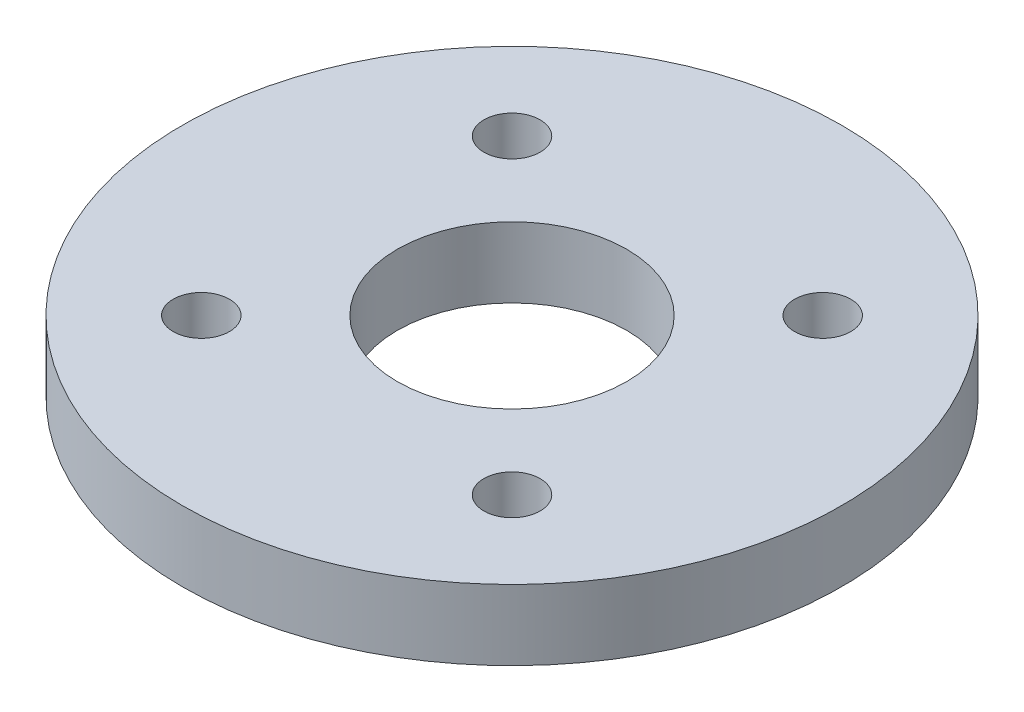
ISO-10303-21;
HEADER;
FILE_DESCRIPTION(('STEP AP214'),'2;1');
FILE_NAME('part.step','',(''),(''),'','','');
FILE_SCHEMA(('AUTOMOTIVE_DESIGN { 1 0 10303 214 1 1 1 1 }'));
ENDSEC;
DATA;
#1=APPLICATION_CONTEXT('core data for automotive mechanical design processes');
#2=APPLICATION_PROTOCOL_DEFINITION('international standard','automotive_design',2000,#1);
#3=PRODUCT_CONTEXT('',#1,'mechanical');
#4=PRODUCT('Part','Part','',(#3));
#5=PRODUCT_RELATED_PRODUCT_CATEGORY('part','',(#4));
#6=PRODUCT_DEFINITION_FORMATION('','',#4);
#7=PRODUCT_DEFINITION_CONTEXT('part definition',#1,'design');
#8=PRODUCT_DEFINITION('design','',#6,#7);
#9=PRODUCT_DEFINITION_SHAPE('','',#8);
#10=(LENGTH_UNIT() NAMED_UNIT(*) SI_UNIT(.MILLI.,.METRE.));
#11=(NAMED_UNIT(*) PLANE_ANGLE_UNIT() SI_UNIT($,.RADIAN.));
#12=(NAMED_UNIT(*) SI_UNIT($,.STERADIAN.) SOLID_ANGLE_UNIT());
#13=UNCERTAINTY_MEASURE_WITH_UNIT(LENGTH_MEASURE(1.E-05),#10,'distance_accuracy_value','');
#14=(GEOMETRIC_REPRESENTATION_CONTEXT(3) GLOBAL_UNCERTAINTY_ASSIGNED_CONTEXT((#13)) GLOBAL_UNIT_ASSIGNED_CONTEXT((#10,
#11,#12)) REPRESENTATION_CONTEXT('',''));
#15=CARTESIAN_POINT('',(0.,0.,0.));
#16=DIRECTION('',(0.,0.,1.));
#17=DIRECTION('',(1.,0.,0.));
#18=AXIS2_PLACEMENT_3D('',#15,#16,#17);
#19=CARTESIAN_POINT('',(-8.83883476483184,4.,-8.83883476483184));
#20=DIRECTION('',(0.,-1.,0.));
#21=DIRECTION('',(0.,0.,-1.));
#22=AXIS2_PLACEMENT_3D('',#19,#20,#21);
#23=CYLINDRICAL_SURFACE('',#22,1.6);
#24=CARTESIAN_POINT('',(-8.83883476483184,4.,-8.83883476483184));
#25=DIRECTION('',(0.,1.,0.));
#26=DIRECTION('',(0.,0.,1.));
#27=AXIS2_PLACEMENT_3D('',#24,#25,#26);
#28=CIRCLE('',#27,1.6);
#29=CARTESIAN_POINT('',(-8.83883476483184,4.,-7.23883476483184));
#30=VERTEX_POINT('',#29);
#31=EDGE_CURVE('E45',#30,#30,#28,.T.);
#32=ORIENTED_EDGE('',*,*,#31,.T.);
#33=EDGE_LOOP('',(#32));
#34=FACE_BOUND('',#33,.T.);
#35=CARTESIAN_POINT('',(-8.83883476483184,0.,-8.83883476483184));
#36=DIRECTION('',(0.,1.,0.));
#37=DIRECTION('',(0.,0.,1.));
#38=AXIS2_PLACEMENT_3D('',#35,#36,#37);
#39=CIRCLE('',#38,1.6);
#40=CARTESIAN_POINT('',(-8.83883476483184,0.,-7.23883476483184));
#41=VERTEX_POINT('',#40);
#42=EDGE_CURVE('E65',#41,#41,#39,.T.);
#43=ORIENTED_EDGE('',*,*,#42,.F.);
#44=EDGE_LOOP('',(#43));
#45=FACE_BOUND('',#44,.T.);
#46=ADVANCED_FACE('F37',(#34,#45),#23,.F.);
#47=CARTESIAN_POINT('',(-8.83883476483184,4.,8.83883476483185));
#48=DIRECTION('',(0.,-1.,0.));
#49=DIRECTION('',(0.,0.,-1.));
#50=AXIS2_PLACEMENT_3D('',#47,#48,#49);
#51=CYLINDRICAL_SURFACE('',#50,1.6);
#52=CARTESIAN_POINT('',(-8.83883476483184,4.,8.83883476483185));
#53=DIRECTION('',(0.,1.,0.));
#54=DIRECTION('',(0.,0.,1.));
#55=AXIS2_PLACEMENT_3D('',#52,#53,#54);
#56=CIRCLE('',#55,1.6);
#57=CARTESIAN_POINT('',(-8.83883476483184,4.,10.4388347648318));
#58=VERTEX_POINT('',#57);
#59=EDGE_CURVE('E50',#58,#58,#56,.T.);
#60=ORIENTED_EDGE('',*,*,#59,.T.);
#61=EDGE_LOOP('',(#60));
#62=FACE_BOUND('',#61,.T.);
#63=CARTESIAN_POINT('',(-8.83883476483184,0.,8.83883476483185));
#64=DIRECTION('',(0.,1.,0.));
#65=DIRECTION('',(0.,0.,1.));
#66=AXIS2_PLACEMENT_3D('',#63,#64,#65);
#67=CIRCLE('',#66,1.6);
#68=CARTESIAN_POINT('',(-8.83883476483184,0.,10.4388347648318));
#69=VERTEX_POINT('',#68);
#70=EDGE_CURVE('E63',#69,#69,#67,.T.);
#71=ORIENTED_EDGE('',*,*,#70,.F.);
#72=EDGE_LOOP('',(#71));
#73=FACE_BOUND('',#72,.T.);
#74=ADVANCED_FACE('F86',(#62,#73),#51,.F.);
#75=CARTESIAN_POINT('',(8.83883476483185,4.,8.83883476483184));
#76=DIRECTION('',(0.,-1.,0.));
#77=DIRECTION('',(0.,0.,-1.));
#78=AXIS2_PLACEMENT_3D('',#75,#76,#77);
#79=CYLINDRICAL_SURFACE('',#78,1.6);
#80=CARTESIAN_POINT('',(8.83883476483185,4.,8.83883476483184));
#81=DIRECTION('',(0.,1.,0.));
#82=DIRECTION('',(0.,0.,1.));
#83=AXIS2_PLACEMENT_3D('',#80,#81,#82);
#84=CIRCLE('',#83,1.6);
#85=CARTESIAN_POINT('',(8.83883476483185,4.,10.4388347648318));
#86=VERTEX_POINT('',#85);
#87=EDGE_CURVE('E79',#86,#86,#84,.T.);
#88=ORIENTED_EDGE('',*,*,#87,.T.);
#89=EDGE_LOOP('',(#88));
#90=FACE_BOUND('',#89,.T.);
#91=CARTESIAN_POINT('',(8.83883476483185,0.,8.83883476483184));
#92=DIRECTION('',(0.,1.,0.));
#93=DIRECTION('',(0.,0.,1.));
#94=AXIS2_PLACEMENT_3D('',#91,#92,#93);
#95=CIRCLE('',#94,1.6);
#96=CARTESIAN_POINT('',(8.83883476483185,0.,10.4388347648318));
#97=VERTEX_POINT('',#96);
#98=EDGE_CURVE('E60',#97,#97,#95,.T.);
#99=ORIENTED_EDGE('',*,*,#98,.F.);
#100=EDGE_LOOP('',(#99));
#101=FACE_BOUND('',#100,.T.);
#102=ADVANCED_FACE('F104',(#90,#101),#79,.F.);
#103=CARTESIAN_POINT('',(8.83883476483184,4.,-8.83883476483184));
#104=DIRECTION('',(0.,-1.,0.));
#105=DIRECTION('',(0.,0.,-1.));
#106=AXIS2_PLACEMENT_3D('',#103,#104,#105);
#107=CYLINDRICAL_SURFACE('',#106,1.6);
#108=CARTESIAN_POINT('',(8.83883476483184,4.,-8.83883476483184));
#109=DIRECTION('',(0.,1.,0.));
#110=DIRECTION('',(0.,0.,1.));
#111=AXIS2_PLACEMENT_3D('',#108,#109,#110);
#112=CIRCLE('',#111,1.6);
#113=CARTESIAN_POINT('',(8.83883476483184,4.,-7.23883476483184));
#114=VERTEX_POINT('',#113);
#115=EDGE_CURVE('E74',#114,#114,#112,.T.);
#116=ORIENTED_EDGE('',*,*,#115,.T.);
#117=EDGE_LOOP('',(#116));
#118=FACE_BOUND('',#117,.T.);
#119=CARTESIAN_POINT('',(8.83883476483184,0.,-8.83883476483184));
#120=DIRECTION('',(0.,1.,0.));
#121=DIRECTION('',(0.,0.,1.));
#122=AXIS2_PLACEMENT_3D('',#119,#120,#121);
#123=CIRCLE('',#122,1.6);
#124=CARTESIAN_POINT('',(8.83883476483184,0.,-7.23883476483184));
#125=VERTEX_POINT('',#124);
#126=EDGE_CURVE('E57',#125,#125,#123,.T.);
#127=ORIENTED_EDGE('',*,*,#126,.F.);
#128=EDGE_LOOP('',(#127));
#129=FACE_BOUND('',#128,.T.);
#130=ADVANCED_FACE('F110',(#118,#129),#107,.F.);
#131=CARTESIAN_POINT('',(0.,4.,0.));
#132=DIRECTION('',(0.,-1.,0.));
#133=DIRECTION('',(0.,0.,-1.));
#134=AXIS2_PLACEMENT_3D('',#131,#132,#133);
#135=CYLINDRICAL_SURFACE('',#134,6.525);
#136=CARTESIAN_POINT('',(0.,4.,0.));
#137=DIRECTION('',(0.,1.,0.));
#138=DIRECTION('',(0.,0.,1.));
#139=AXIS2_PLACEMENT_3D('',#136,#137,#138);
#140=CIRCLE('',#139,6.525);
#141=CARTESIAN_POINT('',(0.,4.,6.525));
#142=VERTEX_POINT('',#141);
#143=EDGE_CURVE('E70',#142,#142,#140,.T.);
#144=ORIENTED_EDGE('',*,*,#143,.T.);
#145=EDGE_LOOP('',(#144));
#146=FACE_BOUND('',#145,.T.);
#147=CARTESIAN_POINT('',(0.,0.,0.));
#148=DIRECTION('',(0.,1.,0.));
#149=DIRECTION('',(0.,0.,1.));
#150=AXIS2_PLACEMENT_3D('',#147,#148,#149);
#151=CIRCLE('',#150,6.525);
#152=CARTESIAN_POINT('',(0.,0.,6.525));
#153=VERTEX_POINT('',#152);
#154=EDGE_CURVE('E54',#153,#153,#151,.T.);
#155=ORIENTED_EDGE('',*,*,#154,.F.);
#156=EDGE_LOOP('',(#155));
#157=FACE_BOUND('',#156,.T.);
#158=ADVANCED_FACE('F39',(#146,#157),#135,.F.);
#159=CARTESIAN_POINT('',(0.,4.,0.));
#160=DIRECTION('',(0.,-1.,0.));
#161=DIRECTION('',(0.,0.,-1.));
#162=AXIS2_PLACEMENT_3D('',#159,#160,#161);
#163=CYLINDRICAL_SURFACE('',#162,18.75);
#164=CARTESIAN_POINT('',(0.,4.,0.));
#165=DIRECTION('',(0.,1.,0.));
#166=DIRECTION('',(0.,0.,1.));
#167=AXIS2_PLACEMENT_3D('',#164,#165,#166);
#168=CIRCLE('',#167,18.75);
#169=CARTESIAN_POINT('',(0.,4.,18.75));
#170=VERTEX_POINT('',#169);
#171=EDGE_CURVE('E10',#170,#170,#168,.T.);
#172=ORIENTED_EDGE('',*,*,#171,.F.);
#173=EDGE_LOOP('',(#172));
#174=FACE_BOUND('',#173,.T.);
#175=CARTESIAN_POINT('',(0.,0.,0.));
#176=DIRECTION('',(0.,1.,0.));
#177=DIRECTION('',(0.,0.,1.));
#178=AXIS2_PLACEMENT_3D('',#175,#176,#177);
#179=CIRCLE('',#178,18.75);
#180=CARTESIAN_POINT('',(0.,0.,18.75));
#181=VERTEX_POINT('',#180);
#182=EDGE_CURVE('E41',#181,#181,#179,.T.);
#183=ORIENTED_EDGE('',*,*,#182,.T.);
#184=EDGE_LOOP('',(#183));
#185=FACE_BOUND('',#184,.T.);
#186=ADVANCED_FACE('F93',(#174,#185),#163,.T.);
#187=CARTESIAN_POINT('',(0.,4.,0.));
#188=DIRECTION('',(0.,1.,0.));
#189=DIRECTION('',(0.,0.,1.));
#190=AXIS2_PLACEMENT_3D('',#187,#188,#189);
#191=PLANE('',#190);
#192=ORIENTED_EDGE('',*,*,#143,.F.);
#193=EDGE_LOOP('',(#192));
#194=FACE_BOUND('',#193,.T.);
#195=ORIENTED_EDGE('',*,*,#115,.F.);
#196=EDGE_LOOP('',(#195));
#197=FACE_BOUND('',#196,.T.);
#198=ORIENTED_EDGE('',*,*,#87,.F.);
#199=EDGE_LOOP('',(#198));
#200=FACE_BOUND('',#199,.T.);
#201=ORIENTED_EDGE('',*,*,#59,.F.);
#202=EDGE_LOOP('',(#201));
#203=FACE_BOUND('',#202,.T.);
#204=ORIENTED_EDGE('',*,*,#31,.F.);
#205=EDGE_LOOP('',(#204));
#206=FACE_BOUND('',#205,.T.);
#207=ORIENTED_EDGE('',*,*,#171,.T.);
#208=EDGE_LOOP('',(#207));
#209=FACE_BOUND('',#208,.T.);
#210=ADVANCED_FACE('F89',(#194,#197,#200,#203,#206,#209),#191,.T.);
#211=CARTESIAN_POINT('',(0.,0.,0.));
#212=DIRECTION('',(0.,1.,0.));
#213=DIRECTION('',(0.,0.,1.));
#214=AXIS2_PLACEMENT_3D('',#211,#212,#213);
#215=PLANE('',#214);
#216=ORIENTED_EDGE('',*,*,#154,.T.);
#217=EDGE_LOOP('',(#216));
#218=FACE_BOUND('',#217,.T.);
#219=ORIENTED_EDGE('',*,*,#126,.T.);
#220=EDGE_LOOP('',(#219));
#221=FACE_BOUND('',#220,.T.);
#222=ORIENTED_EDGE('',*,*,#98,.T.);
#223=EDGE_LOOP('',(#222));
#224=FACE_BOUND('',#223,.T.);
#225=ORIENTED_EDGE('',*,*,#70,.T.);
#226=EDGE_LOOP('',(#225));
#227=FACE_BOUND('',#226,.T.);
#228=ORIENTED_EDGE('',*,*,#42,.T.);
#229=EDGE_LOOP('',(#228));
#230=FACE_BOUND('',#229,.T.);
#231=ORIENTED_EDGE('',*,*,#182,.F.);
#232=EDGE_LOOP('',(#231));
#233=FACE_BOUND('',#232,.T.);
#234=ADVANCED_FACE('F92',(#218,#221,#224,#227,#230,#233),#215,.F.);
#235=CLOSED_SHELL('',(#46,#74,#102,#130,#158,#186,#210,#234));
#236=MANIFOLD_SOLID_BREP('B2',#235);
#237=ADVANCED_BREP_SHAPE_REPRESENTATION('',(#18,#236),#14);
#238=SHAPE_DEFINITION_REPRESENTATION(#9,#237);
ENDSEC;
END-ISO-10303-21;
